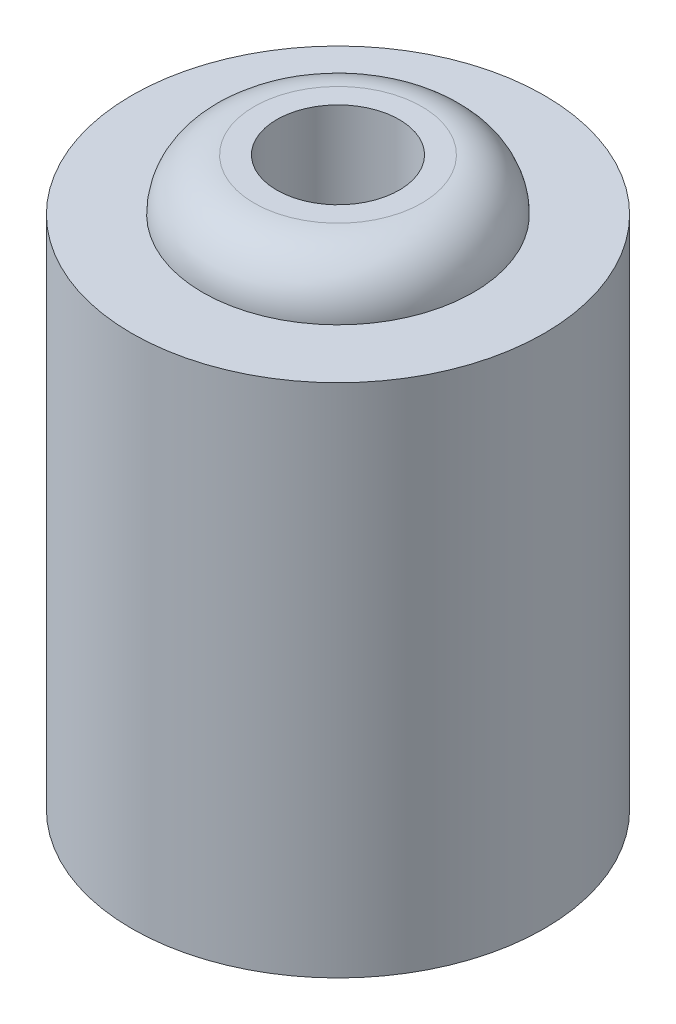
ISO-10303-21;
HEADER;
FILE_DESCRIPTION(('STEP AP214'),'2;1');
FILE_NAME('part.step','',(''),(''),'','','');
FILE_SCHEMA(('AUTOMOTIVE_DESIGN { 1 0 10303 214 1 1 1 1 }'));
ENDSEC;
DATA;
#1=APPLICATION_CONTEXT('core data for automotive mechanical design processes');
#2=APPLICATION_PROTOCOL_DEFINITION('international standard','automotive_design',2000,#1);
#3=PRODUCT_CONTEXT('',#1,'mechanical');
#4=PRODUCT('Part','Part','',(#3));
#5=PRODUCT_RELATED_PRODUCT_CATEGORY('part','',(#4));
#6=PRODUCT_DEFINITION_FORMATION('','',#4);
#7=PRODUCT_DEFINITION_CONTEXT('part definition',#1,'design');
#8=PRODUCT_DEFINITION('design','',#6,#7);
#9=PRODUCT_DEFINITION_SHAPE('','',#8);
#10=(LENGTH_UNIT() NAMED_UNIT(*) SI_UNIT(.MILLI.,.METRE.));
#11=(NAMED_UNIT(*) PLANE_ANGLE_UNIT() SI_UNIT($,.RADIAN.));
#12=(NAMED_UNIT(*) SI_UNIT($,.STERADIAN.) SOLID_ANGLE_UNIT());
#13=UNCERTAINTY_MEASURE_WITH_UNIT(LENGTH_MEASURE(1.E-05),#10,'distance_accuracy_value','');
#14=(GEOMETRIC_REPRESENTATION_CONTEXT(3) GLOBAL_UNCERTAINTY_ASSIGNED_CONTEXT((#13)) GLOBAL_UNIT_ASSIGNED_CONTEXT((#10,
#11,#12)) REPRESENTATION_CONTEXT('',''));
#15=CARTESIAN_POINT('',(0.,0.,0.));
#16=DIRECTION('',(0.,0.,1.));
#17=DIRECTION('',(1.,0.,0.));
#18=AXIS2_PLACEMENT_3D('',#15,#16,#17);
#19=CARTESIAN_POINT('',(0.,20.,0.));
#20=DIRECTION('',(0.,1.,0.));
#21=DIRECTION('',(0.,0.,1.));
#22=AXIS2_PLACEMENT_3D('',#19,#20,#21);
#23=PLANE('',#22);
#24=CARTESIAN_POINT('',(0.,20.,0.));
#25=DIRECTION('',(0.,1.,0.));
#26=DIRECTION('',(0.,0.,1.));
#27=AXIS2_PLACEMENT_3D('',#24,#25,#26);
#28=CIRCLE('',#27,8.);
#29=CARTESIAN_POINT('',(0.,20.,8.));
#30=VERTEX_POINT('',#29);
#31=EDGE_CURVE('E45',#30,#30,#28,.T.);
#32=ORIENTED_EDGE('',*,*,#31,.T.);
#33=EDGE_LOOP('',(#32));
#34=FACE_BOUND('',#33,.T.);
#35=CARTESIAN_POINT('',(0.,20.,0.));
#36=DIRECTION('',(0.,1.,0.));
#37=DIRECTION('',(0.,0.,1.));
#38=AXIS2_PLACEMENT_3D('',#35,#36,#37);
#39=CIRCLE('',#38,5.25);
#40=CARTESIAN_POINT('',(0.,20.,5.25));
#41=VERTEX_POINT('',#40);
#42=EDGE_CURVE('E61',#41,#41,#39,.T.);
#43=ORIENTED_EDGE('',*,*,#42,.F.);
#44=EDGE_LOOP('',(#43));
#45=FACE_BOUND('',#44,.T.);
#46=ADVANCED_FACE('F37',(#34,#45),#23,.T.);
#47=CARTESIAN_POINT('',(0.,0.,0.));
#48=DIRECTION('',(0.,1.,0.));
#49=DIRECTION('',(0.,0.,1.));
#50=AXIS2_PLACEMENT_3D('',#47,#48,#49);
#51=PLANE('',#50);
#52=CARTESIAN_POINT('',(0.,0.,0.));
#53=DIRECTION('',(0.,1.,0.));
#54=DIRECTION('',(0.,0.,1.));
#55=AXIS2_PLACEMENT_3D('',#52,#53,#54);
#56=CIRCLE('',#55,8.);
#57=CARTESIAN_POINT('',(0.,0.,8.));
#58=VERTEX_POINT('',#57);
#59=EDGE_CURVE('E50',#58,#58,#56,.T.);
#60=ORIENTED_EDGE('',*,*,#59,.F.);
#61=EDGE_LOOP('',(#60));
#62=FACE_BOUND('',#61,.T.);
#63=CARTESIAN_POINT('',(0.,0.,0.));
#64=DIRECTION('',(0.,1.,0.));
#65=DIRECTION('',(0.,0.,1.));
#66=AXIS2_PLACEMENT_3D('',#63,#64,#65);
#67=CIRCLE('',#66,2.375);
#68=CARTESIAN_POINT('',(0.,0.,2.375));
#69=VERTEX_POINT('',#68);
#70=EDGE_CURVE('E56',#69,#69,#67,.T.);
#71=ORIENTED_EDGE('',*,*,#70,.T.);
#72=EDGE_LOOP('',(#71));
#73=FACE_BOUND('',#72,.T.);
#74=ADVANCED_FACE('F84',(#62,#73),#51,.F.);
#75=CARTESIAN_POINT('',(0.,20.,0.));
#76=DIRECTION('',(0.,-1.,0.));
#77=DIRECTION('',(0.,0.,-1.));
#78=AXIS2_PLACEMENT_3D('',#75,#76,#77);
#79=CYLINDRICAL_SURFACE('',#78,8.);
#80=ORIENTED_EDGE('',*,*,#31,.F.);
#81=EDGE_LOOP('',(#80));
#82=FACE_BOUND('',#81,.T.);
#83=ORIENTED_EDGE('',*,*,#59,.T.);
#84=EDGE_LOOP('',(#83));
#85=FACE_BOUND('',#84,.T.);
#86=ADVANCED_FACE('F80',(#82,#85),#79,.T.);
#87=CARTESIAN_POINT('',(0.,20.,0.));
#88=DIRECTION('',(0.,-1.,0.));
#89=DIRECTION('',(0.,0.,-1.));
#90=AXIS2_PLACEMENT_3D('',#87,#88,#89);
#91=CYLINDRICAL_SURFACE('',#90,2.375);
#92=ORIENTED_EDGE('',*,*,#70,.F.);
#93=EDGE_LOOP('',(#92));
#94=FACE_BOUND('',#93,.T.);
#95=CARTESIAN_POINT('',(0.,22.,0.));
#96=DIRECTION('',(0.,1.,0.));
#97=DIRECTION('',(0.,0.,1.));
#98=AXIS2_PLACEMENT_3D('',#95,#96,#97);
#99=CIRCLE('',#98,2.375);
#100=CARTESIAN_POINT('',(0.,22.,2.375));
#101=VERTEX_POINT('',#100);
#102=EDGE_CURVE('E65',#101,#101,#99,.T.);
#103=ORIENTED_EDGE('',*,*,#102,.T.);
#104=EDGE_LOOP('',(#103));
#105=FACE_BOUND('',#104,.T.);
#106=ADVANCED_FACE('F70',(#94,#105),#91,.F.);
#107=CARTESIAN_POINT('',(0.,22.,0.));
#108=DIRECTION('',(0.,1.,0.));
#109=DIRECTION('',(0.,0.,1.));
#110=AXIS2_PLACEMENT_3D('',#107,#108,#109);
#111=PLANE('',#110);
#112=CARTESIAN_POINT('',(0.,22.,0.));
#113=DIRECTION('',(0.,1.,0.));
#114=DIRECTION('',(0.,0.,1.));
#115=AXIS2_PLACEMENT_3D('',#112,#113,#114);
#116=CIRCLE('',#115,3.25);
#117=CARTESIAN_POINT('',(0.,22.,3.25));
#118=VERTEX_POINT('',#117);
#119=EDGE_CURVE('E10',#118,#118,#116,.T.);
#120=ORIENTED_EDGE('',*,*,#119,.T.);
#121=EDGE_LOOP('',(#120));
#122=FACE_BOUND('',#121,.T.);
#123=ORIENTED_EDGE('',*,*,#102,.F.);
#124=EDGE_LOOP('',(#123));
#125=FACE_BOUND('',#124,.T.);
#126=ADVANCED_FACE('F72',(#122,#125),#111,.T.);
#127=CARTESIAN_POINT('',(0.,20.,0.));
#128=DIRECTION('',(0.,1.,0.));
#129=DIRECTION('',(0.,0.,1.));
#130=AXIS2_PLACEMENT_3D('',#127,#128,#129);
#131=TOROIDAL_SURFACE('',#130,3.25,2.);
#132=ORIENTED_EDGE('',*,*,#42,.T.);
#133=EDGE_LOOP('',(#132));
#134=FACE_BOUND('',#133,.T.);
#135=ORIENTED_EDGE('',*,*,#119,.F.);
#136=EDGE_LOOP('',(#135));
#137=FACE_BOUND('',#136,.T.);
#138=ADVANCED_FACE('F39',(#134,#137),#131,.T.);
#139=CLOSED_SHELL('',(#46,#74,#86,#106,#126,#138));
#140=MANIFOLD_SOLID_BREP('B2',#139);
#141=ADVANCED_BREP_SHAPE_REPRESENTATION('',(#18,#140),#14);
#142=SHAPE_DEFINITION_REPRESENTATION(#9,#141);
ENDSEC;
END-ISO-10303-21;
